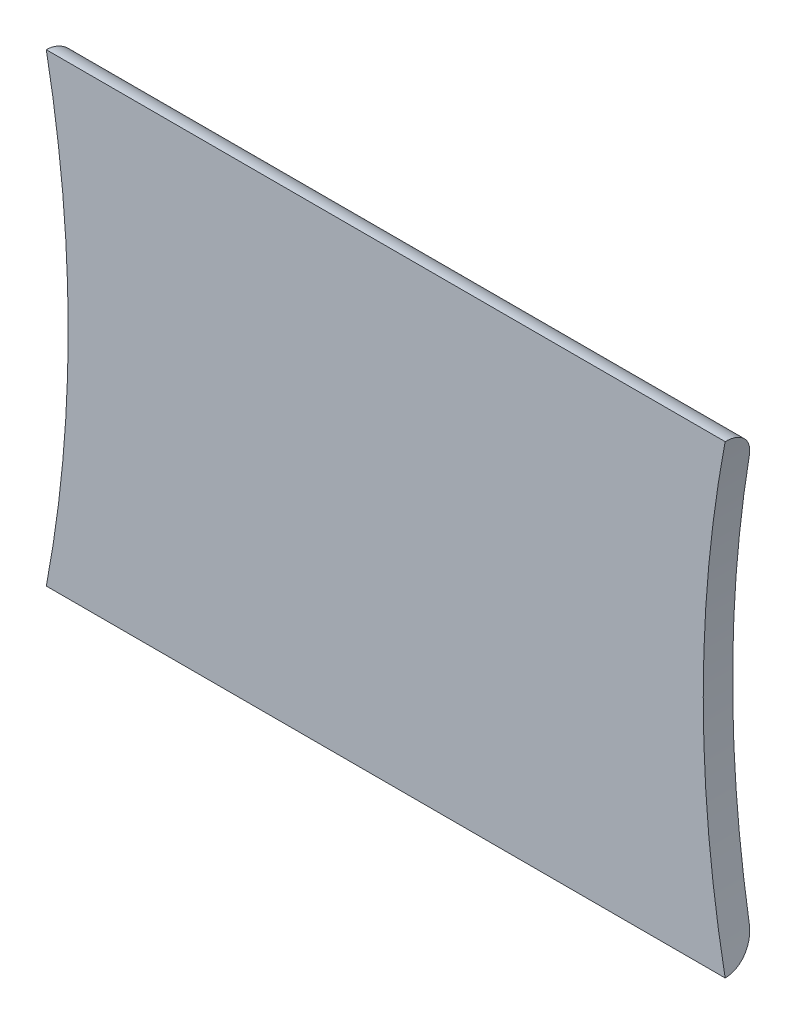
ISO-10303-21;
HEADER;
FILE_DESCRIPTION(('STEP AP214'),'2;1');
FILE_NAME('part.step','',(''),(''),'','','');
FILE_SCHEMA(('AUTOMOTIVE_DESIGN { 1 0 10303 214 1 1 1 1 }'));
ENDSEC;
DATA;
#1=APPLICATION_CONTEXT('core data for automotive mechanical design processes');
#2=APPLICATION_PROTOCOL_DEFINITION('international standard','automotive_design',2000,#1);
#3=PRODUCT_CONTEXT('',#1,'mechanical');
#4=PRODUCT('Part','Part','',(#3));
#5=PRODUCT_RELATED_PRODUCT_CATEGORY('part','',(#4));
#6=PRODUCT_DEFINITION_FORMATION('','',#4);
#7=PRODUCT_DEFINITION_CONTEXT('part definition',#1,'design');
#8=PRODUCT_DEFINITION('design','',#6,#7);
#9=PRODUCT_DEFINITION_SHAPE('','',#8);
#10=(LENGTH_UNIT() NAMED_UNIT(*) SI_UNIT(.MILLI.,.METRE.));
#11=(NAMED_UNIT(*) PLANE_ANGLE_UNIT() SI_UNIT($,.RADIAN.));
#12=(NAMED_UNIT(*) SI_UNIT($,.STERADIAN.) SOLID_ANGLE_UNIT());
#13=UNCERTAINTY_MEASURE_WITH_UNIT(LENGTH_MEASURE(1.E-05),#10,'distance_accuracy_value','');
#14=(GEOMETRIC_REPRESENTATION_CONTEXT(3) GLOBAL_UNCERTAINTY_ASSIGNED_CONTEXT((#13)) GLOBAL_UNIT_ASSIGNED_CONTEXT((#10,
#11,#12)) REPRESENTATION_CONTEXT('',''));
#15=CARTESIAN_POINT('',(0.,0.,0.));
#16=DIRECTION('',(0.,0.,1.));
#17=DIRECTION('',(1.,0.,0.));
#18=AXIS2_PLACEMENT_3D('',#15,#16,#17);
#19=CARTESIAN_POINT('',(0.,0.,0.));
#20=DIRECTION('',(0.,0.,1.));
#21=DIRECTION('',(1.,0.,0.));
#22=AXIS2_PLACEMENT_3D('',#19,#20,#21);
#23=PLANE('',#22);
#24=DIRECTION('',(-1.,0.,0.));
#25=VECTOR('',#24,1.);
#26=CARTESIAN_POINT('',(0.8,0.69,0.));
#27=LINE('',#26,#25);
#28=CARTESIAN_POINT('',(1.13670119095473,0.69,0.));
#29=VERTEX_POINT('',#28);
#30=CARTESIAN_POINT('',(-1.13670119095473,0.69,0.));
#31=VERTEX_POINT('',#30);
#32=EDGE_CURVE('E61',#29,#31,#27,.T.);
#33=ORIENTED_EDGE('',*,*,#32,.F.);
#34=CARTESIAN_POINT('',(5.306675110214,0.,0.));
#35=DIRECTION('',(0.,0.,1.));
#36=DIRECTION('',(1.,0.,0.));
#37=AXIS2_PLACEMENT_3D('',#34,#35,#36);
#38=CIRCLE('',#37,4.226675110214);
#39=CARTESIAN_POINT('',(1.13670119095473,-0.689999999999999,0.));
#40=VERTEX_POINT('',#39);
#41=EDGE_CURVE('E20',#40,#29,#38,.F.);
#42=ORIENTED_EDGE('',*,*,#41,.F.);
#43=DIRECTION('',(1.,0.,0.));
#44=VECTOR('',#43,1.);
#45=CARTESIAN_POINT('',(-0.8,-0.69,0.));
#46=LINE('',#45,#44);
#47=CARTESIAN_POINT('',(-1.13670119095473,-0.69,0.));
#48=VERTEX_POINT('',#47);
#49=EDGE_CURVE('E59',#48,#40,#46,.T.);
#50=ORIENTED_EDGE('',*,*,#49,.F.);
#51=CARTESIAN_POINT('',(-5.306675110214,0.,0.));
#52=DIRECTION('',(0.,0.,1.));
#53=DIRECTION('',(1.,0.,0.));
#54=AXIS2_PLACEMENT_3D('',#51,#52,#53);
#55=CIRCLE('',#54,4.226675110214);
#56=EDGE_CURVE('E63',#48,#31,#55,.T.);
#57=ORIENTED_EDGE('',*,*,#56,.T.);
#58=EDGE_LOOP('',(#33,#42,#50,#57));
#59=FACE_BOUND('',#58,.T.);
#60=ADVANCED_FACE('F17',(#59),#23,.F.);
#61=CARTESIAN_POINT('',(-0.8,-0.69,0.1));
#62=DIRECTION('',(1.,0.,0.));
#63=DIRECTION('',(0.,1.,0.));
#64=AXIS2_PLACEMENT_3D('',#61,#62,#63);
#65=CYLINDRICAL_SURFACE('',#64,0.1);
#66=CARTESIAN_POINT('',(1.13670119095474,-0.690000000000043,0.));
#67=CARTESIAN_POINT('',(1.13764318933457,-0.695695699680426,-4.43014356738933E-06));
#68=CARTESIAN_POINT('',(1.13859752881482,-0.701388029645845,0.000486347338758851));
#69=CARTESIAN_POINT('',(1.14050101488891,-0.712605937558876,0.00242379898542941));
#70=CARTESIAN_POINT('',(1.14145016366756,-0.71813159093303,0.00387003377686836));
#71=CARTESIAN_POINT('',(1.14331480683943,-0.728864499019191,0.00768495035058426));
#72=CARTESIAN_POINT('',(1.14423028313917,-0.73407158352077,0.0100541203593363));
#73=CARTESIAN_POINT('',(1.14599590347629,-0.744013754734849,0.0156493896280914));
#74=CARTESIAN_POINT('',(1.14684606347095,-0.748748956816435,0.0188752787211139));
#75=CARTESIAN_POINT('',(1.1484469432885,-0.757589032888459,0.0260804921054843));
#76=CARTESIAN_POINT('',(1.14919810311195,-0.761696709810781,0.0300562775039931));
#77=CARTESIAN_POINT('',(1.15057697965973,-0.769184859667576,0.0386625281507928));
#78=CARTESIAN_POINT('',(1.1512046775953,-0.772565221924776,0.0432930928610539));
#79=CARTESIAN_POINT('',(1.15230313861589,-0.778450305742094,0.0530068816663753));
#80=CARTESIAN_POINT('',(1.15277598685132,-0.780966685879153,0.0580828145482082));
#81=CARTESIAN_POINT('',(1.15355681632423,-0.785108529198617,0.0685958759565284));
#82=CARTESIAN_POINT('',(1.15386493483939,-0.786734734236377,0.0740326994730809));
#83=CARTESIAN_POINT('',(1.15421722820746,-0.788591478664702,0.0829258444698361));
#84=CARTESIAN_POINT('',(1.15431754491512,-0.789119352108425,0.0863207288915904));
#85=CARTESIAN_POINT('',(1.154451450244,-0.789823529387619,0.0931432076852279));
#86=CARTESIAN_POINT('',(1.15448513283932,-0.790000328344918,0.0965707491313702));
#87=CARTESIAN_POINT('',(1.15448502698045,-0.790000000000171,0.0999999999999665));
#88=B_SPLINE_CURVE_WITH_KNOTS('',3,(#66,#67,#68,#69,#70,#71,#72,#73,#74,#75,#76,#77,#78,#79,#80,
#81,#82,#83,#84,#85,#86,#87),.UNSPECIFIED.,.F.,.F.,(4,2,2,2,2,2,2,2,2,2,4),(0.,
0.0172965883908819,0.0345852283707785,0.0518830263702726,0.0691765848549442,0.0863904862874064,
0.103607005352155,0.12058112243375,0.137541071981785,0.147835299794453,0.158114999274043),.UNSPECIFIED.);
#89=CARTESIAN_POINT('',(1.15448502698051,-0.79,0.1));
#90=VERTEX_POINT('',#89);
#91=EDGE_CURVE('E58',#40,#90,#88,.T.);
#92=ORIENTED_EDGE('',*,*,#91,.T.);
#93=DIRECTION('',(-1.,0.,0.));
#94=VECTOR('',#93,1.);
#95=CARTESIAN_POINT('',(0.,-0.79,0.1));
#96=LINE('',#95,#94);
#97=CARTESIAN_POINT('',(-1.15448502698051,-0.79,0.1));
#98=VERTEX_POINT('',#97);
#99=EDGE_CURVE('E72',#90,#98,#96,.T.);
#100=ORIENTED_EDGE('',*,*,#99,.T.);
#101=CARTESIAN_POINT('',(-1.15448502698051,-0.79,0.1));
#102=CARTESIAN_POINT('',(-1.15448631273305,-0.790005087146857,0.0944431503603694));
#103=CARTESIAN_POINT('',(-1.15439696772321,-0.789537143585382,0.088888385017141));
#104=CARTESIAN_POINT('',(-1.15404666825362,-0.787693522979548,0.0779443878823904));
#105=CARTESIAN_POINT('',(-1.15378594045839,-0.786319044876082,0.0725549472789211));
#106=CARTESIAN_POINT('',(-1.15310238228103,-0.782699977102862,0.0620859724292192));
#107=CARTESIAN_POINT('',(-1.15267950514041,-0.780455136447335,0.0570065280658263));
#108=CARTESIAN_POINT('',(-1.15168915351814,-0.775165432988514,0.0472990855159549));
#109=CARTESIAN_POINT('',(-1.15112168197221,-0.77212058642789,0.0426710781664815));
#110=CARTESIAN_POINT('',(-1.14985867669438,-0.765291925059744,0.0339542753489224));
#111=CARTESIAN_POINT('',(-1.14916212522611,-0.761502221892582,0.0298702425784687));
#112=CARTESIAN_POINT('',(-1.147669745872,-0.753308820601576,0.0223935640785245));
#113=CARTESIAN_POINT('',(-1.14687389469198,-0.748904978381558,0.0190010810693797));
#114=CARTESIAN_POINT('',(-1.14519704768687,-0.739530821716076,0.0129462909806771));
#115=CARTESIAN_POINT('',(-1.14431486930304,-0.734552399877286,0.0102968746307346));
#116=CARTESIAN_POINT('',(-1.14250631710719,-0.724229350416602,0.00587321528186872));
#117=CARTESIAN_POINT('',(-1.1415799614916,-0.718884873182395,0.00409861530665663));
#118=CARTESIAN_POINT('',(-1.13998951770043,-0.70959764517668,0.00185966914379735));
#119=CARTESIAN_POINT('',(-1.13932902421101,-0.705708628600777,0.00116291479078394));
#120=CARTESIAN_POINT('',(-1.13801091925601,-0.697880560274931,0.000233081912458959));
#121=CARTESIAN_POINT('',(-1.13735330510573,-0.693941583033748,-6.20340564658158E-07));
#122=CARTESIAN_POINT('',(-1.13670119095475,-0.690000000000308,-1.10750848089819E-12));
#123=B_SPLINE_CURVE_WITH_KNOTS('',3,(#101,#102,#103,#104,#105,#106,#107,#108,#109,#110,#111,
#112,#113,#114,#115,#116,#117,#118,#119,#120,#121,#122),.UNSPECIFIED.,.F.,.F.,(4,2,2,2,2,2,2,2,
2,2,4),(0.,0.0166470548257729,0.0332721370528382,0.0499020170119483,0.066531559357566,
0.0832982739738871,0.100068929224018,0.1171146910261,0.134153491390027,0.146145101109913,
0.15812054721049),.UNSPECIFIED.);
#124=EDGE_CURVE('E104',#98,#48,#123,.T.);
#125=ORIENTED_EDGE('',*,*,#124,.T.);
#126=ORIENTED_EDGE('',*,*,#49,.T.);
#127=EDGE_LOOP('',(#92,#100,#125,#126));
#128=FACE_BOUND('',#127,.T.);
#129=ADVANCED_FACE('F100',(#128),#65,.T.);
#130=CARTESIAN_POINT('',(-5.306675110214,0.,0.96));
#131=DIRECTION('',(0.,0.,1.));
#132=DIRECTION('',(1.,0.,0.));
#133=AXIS2_PLACEMENT_3D('',#130,#131,#132);
#134=CYLINDRICAL_SURFACE('',#133,4.226675110214);
#135=CARTESIAN_POINT('',(-1.13670119095474,0.690000000000044,0.));
#136=CARTESIAN_POINT('',(-1.13764318933458,0.695695699680426,-4.43014356743287E-06));
#137=CARTESIAN_POINT('',(-1.13859752881482,0.701388029645845,0.000486347338758834));
#138=CARTESIAN_POINT('',(-1.14050101488891,0.712605937558876,0.00242379898542946));
#139=CARTESIAN_POINT('',(-1.14145016366756,0.71813159093303,0.00387003377686846));
#140=CARTESIAN_POINT('',(-1.14331480683943,0.728864499019192,0.00768495035058438));
#141=CARTESIAN_POINT('',(-1.14423028313918,0.734071583520771,0.0100541203593364));
#142=CARTESIAN_POINT('',(-1.14599590347629,0.74401375473485,0.0156493896280916));
#143=CARTESIAN_POINT('',(-1.14684606347095,0.748748956816436,0.0188752787211141));
#144=CARTESIAN_POINT('',(-1.1484469432885,0.757589032888459,0.0260804921054846));
#145=CARTESIAN_POINT('',(-1.14919810311195,0.761696709810781,0.0300562775039933));
#146=CARTESIAN_POINT('',(-1.15057697965973,0.769184859667577,0.038662528150793));
#147=CARTESIAN_POINT('',(-1.1512046775953,0.772565221924776,0.043293092861054));
#148=CARTESIAN_POINT('',(-1.15230313861589,0.778450305742094,0.0530068816663756));
#149=CARTESIAN_POINT('',(-1.15277598685132,0.780966685879153,0.0580828145482085));
#150=CARTESIAN_POINT('',(-1.15355681632423,0.785108529198617,0.0685958759565287));
#151=CARTESIAN_POINT('',(-1.15386493483939,0.786734734236377,0.0740326994730811));
#152=CARTESIAN_POINT('',(-1.15421722820746,0.788591478664703,0.0829258444698363));
#153=CARTESIAN_POINT('',(-1.15431754491513,0.789119352108425,0.0863207288915906));
#154=CARTESIAN_POINT('',(-1.154451450244,0.789823529387619,0.093143207685228));
#155=CARTESIAN_POINT('',(-1.15448513283932,0.790000328344918,0.0965707491313703));
#156=CARTESIAN_POINT('',(-1.15448502698045,0.790000000000171,0.0999999999999665));
#157=B_SPLINE_CURVE_WITH_KNOTS('',3,(#135,#136,#137,#138,#139,#140,#141,#142,#143,#144,#145,
#146,#147,#148,#149,#150,#151,#152,#153,#154,#155,#156),.UNSPECIFIED.,.F.,.F.,(4,2,2,2,2,2,2,2,
2,2,4),(0.,0.0172965883908819,0.0345852283707785,0.0518830263702728,0.0691765848549443,
0.0863904862874064,0.103607005352155,0.12058112243375,0.137541071981785,0.147835299794453,
0.158114999274042),.UNSPECIFIED.);
#158=CARTESIAN_POINT('',(-1.15448502698051,0.79,0.1));
#159=VERTEX_POINT('',#158);
#160=EDGE_CURVE('E66',#31,#159,#157,.T.);
#161=ORIENTED_EDGE('',*,*,#160,.F.);
#162=ORIENTED_EDGE('',*,*,#56,.F.);
#163=ORIENTED_EDGE('',*,*,#124,.F.);
#164=CARTESIAN_POINT('',(-5.306675110214,0.,0.1));
#165=DIRECTION('',(0.,0.,1.));
#166=DIRECTION('',(1.,0.,0.));
#167=AXIS2_PLACEMENT_3D('',#164,#165,#166);
#168=CIRCLE('',#167,4.226675110214);
#169=EDGE_CURVE('E114',#98,#159,#168,.T.);
#170=ORIENTED_EDGE('',*,*,#169,.T.);
#171=EDGE_LOOP('',(#161,#162,#163,#170));
#172=FACE_BOUND('',#171,.T.);
#173=ADVANCED_FACE('F96',(#172),#134,.F.);
#174=CARTESIAN_POINT('',(0.8,0.69,0.1));
#175=DIRECTION('',(-1.,0.,0.));
#176=DIRECTION('',(0.,-1.,0.));
#177=AXIS2_PLACEMENT_3D('',#174,#175,#176);
#178=CYLINDRICAL_SURFACE('',#177,0.1);
#179=CARTESIAN_POINT('',(1.15448502698051,0.79,0.1));
#180=CARTESIAN_POINT('',(1.15448631273305,0.790005087146856,0.0944431503603694));
#181=CARTESIAN_POINT('',(1.15439696772321,0.789537143585382,0.088888385017141));
#182=CARTESIAN_POINT('',(1.15404666825362,0.787693522979548,0.0779443878823904));
#183=CARTESIAN_POINT('',(1.15378594045839,0.786319044876082,0.0725549472789211));
#184=CARTESIAN_POINT('',(1.15310238228103,0.782699977102862,0.0620859724292192));
#185=CARTESIAN_POINT('',(1.15267950514041,0.780455136447335,0.0570065280658264));
#186=CARTESIAN_POINT('',(1.15168915351814,0.775165432988514,0.047299085515955));
#187=CARTESIAN_POINT('',(1.15112168197221,0.77212058642789,0.0426710781664816));
#188=CARTESIAN_POINT('',(1.14985867669438,0.765291925059744,0.0339542753489225));
#189=CARTESIAN_POINT('',(1.14916212522611,0.761502221892582,0.0298702425784688));
#190=CARTESIAN_POINT('',(1.147669745872,0.753308820601576,0.0223935640785245));
#191=CARTESIAN_POINT('',(1.14687389469198,0.748904978381558,0.0190010810693798));
#192=CARTESIAN_POINT('',(1.14519704768687,0.739530821716076,0.0129462909806771));
#193=CARTESIAN_POINT('',(1.14431486930304,0.734552399877286,0.0102968746307346));
#194=CARTESIAN_POINT('',(1.14250631710719,0.724229350416602,0.00587321528186876));
#195=CARTESIAN_POINT('',(1.1415799614916,0.718884873182396,0.0040986153066567));
#196=CARTESIAN_POINT('',(1.13998951770043,0.70959764517668,0.00185966914379739));
#197=CARTESIAN_POINT('',(1.13932902421102,0.705708628600777,0.00116291479078394));
#198=CARTESIAN_POINT('',(1.13801091925601,0.697880560274931,0.000233081912458935));
#199=CARTESIAN_POINT('',(1.13735330510573,0.693941583033747,-6.20340564681386E-07));
#200=CARTESIAN_POINT('',(1.13670119095475,0.690000000000308,-1.10750678641871E-12));
#201=B_SPLINE_CURVE_WITH_KNOTS('',3,(#179,#180,#181,#182,#183,#184,#185,#186,#187,#188,#189,
#190,#191,#192,#193,#194,#195,#196,#197,#198,#199,#200),.UNSPECIFIED.,.F.,.F.,(4,2,2,2,2,2,2,2,
2,2,4),(0.,0.0166470548257728,0.0332721370528381,0.0499020170119483,0.0665315593575659,
0.083298273973887,0.100068929224018,0.1171146910261,0.134153491390027,0.146145101109914,
0.15812054721049),.UNSPECIFIED.);
#202=CARTESIAN_POINT('',(1.15448502698051,0.79,0.1));
#203=VERTEX_POINT('',#202);
#204=EDGE_CURVE('E34',#203,#29,#201,.T.);
#205=ORIENTED_EDGE('',*,*,#204,.T.);
#206=ORIENTED_EDGE('',*,*,#32,.T.);
#207=ORIENTED_EDGE('',*,*,#160,.T.);
#208=DIRECTION('',(-1.,0.,0.));
#209=VECTOR('',#208,1.);
#210=CARTESIAN_POINT('',(0.,0.79,0.1));
#211=LINE('',#210,#209);
#212=EDGE_CURVE('E26',#159,#203,#211,.F.);
#213=ORIENTED_EDGE('',*,*,#212,.T.);
#214=EDGE_LOOP('',(#205,#206,#207,#213));
#215=FACE_BOUND('',#214,.T.);
#216=ADVANCED_FACE('F69',(#215),#178,.T.);
#217=CARTESIAN_POINT('',(5.306675110214,0.,0.96));
#218=DIRECTION('',(0.,0.,1.));
#219=DIRECTION('',(1.,0.,0.));
#220=AXIS2_PLACEMENT_3D('',#217,#218,#219);
#221=CYLINDRICAL_SURFACE('',#220,4.226675110214);
#222=ORIENTED_EDGE('',*,*,#91,.F.);
#223=ORIENTED_EDGE('',*,*,#41,.T.);
#224=ORIENTED_EDGE('',*,*,#204,.F.);
#225=CARTESIAN_POINT('',(5.306675110214,0.,0.1));
#226=DIRECTION('',(0.,0.,1.));
#227=DIRECTION('',(1.,0.,0.));
#228=AXIS2_PLACEMENT_3D('',#225,#226,#227);
#229=CIRCLE('',#228,4.226675110214);
#230=EDGE_CURVE('E11',#203,#90,#229,.T.);
#231=ORIENTED_EDGE('',*,*,#230,.T.);
#232=EDGE_LOOP('',(#222,#223,#224,#231));
#233=FACE_BOUND('',#232,.T.);
#234=ADVANCED_FACE('F56',(#233),#221,.F.);
#235=CARTESIAN_POINT('',(0.,0.,0.1));
#236=DIRECTION('',(0.,0.,-1.));
#237=DIRECTION('',(-1.,0.,0.));
#238=AXIS2_PLACEMENT_3D('',#235,#236,#237);
#239=PLANE('',#238);
#240=ORIENTED_EDGE('',*,*,#212,.F.);
#241=ORIENTED_EDGE('',*,*,#169,.F.);
#242=ORIENTED_EDGE('',*,*,#99,.F.);
#243=ORIENTED_EDGE('',*,*,#230,.F.);
#244=EDGE_LOOP('',(#240,#241,#242,#243));
#245=FACE_BOUND('',#244,.T.);
#246=ADVANCED_FACE('F113',(#245),#239,.F.);
#247=CLOSED_SHELL('',(#60,#129,#173,#216,#234,#246));
#248=MANIFOLD_SOLID_BREP('B1',#247);
#249=ADVANCED_BREP_SHAPE_REPRESENTATION('',(#18,#248),#14);
#250=SHAPE_DEFINITION_REPRESENTATION(#9,#249);
ENDSEC;
END-ISO-10303-21;
